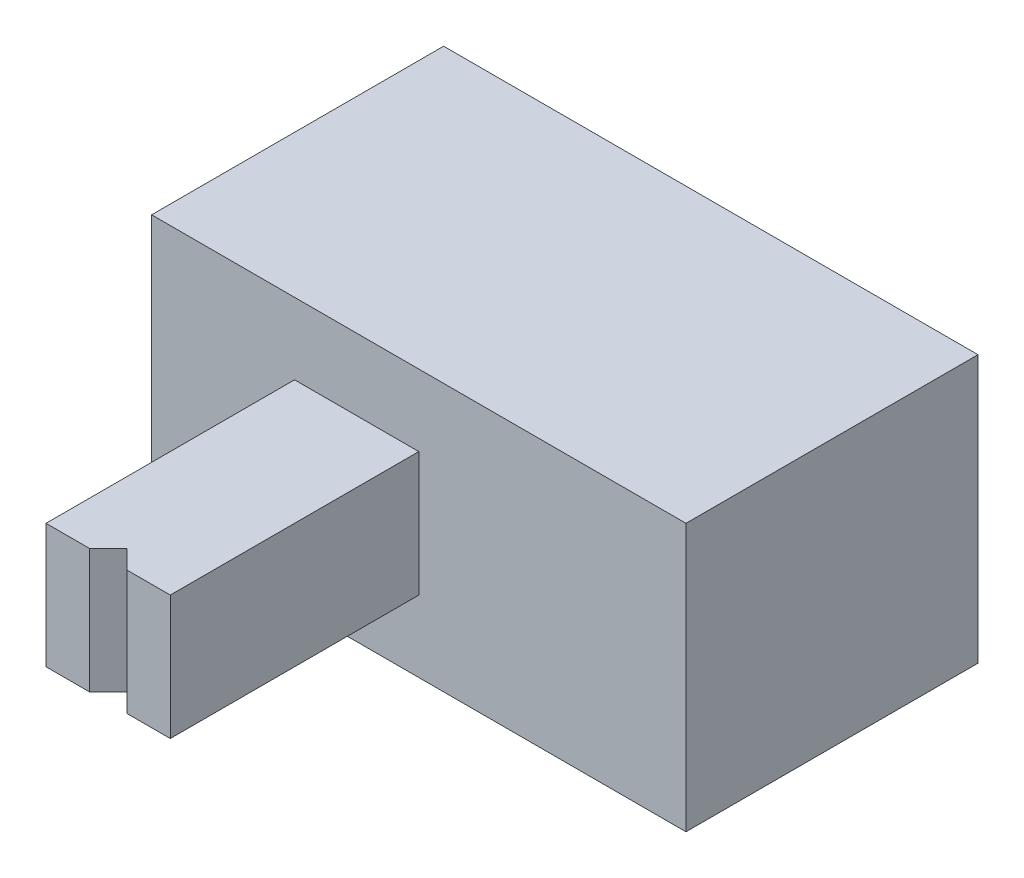
ISO-10303-21;
HEADER;
FILE_DESCRIPTION(('STEP AP214'),'2;1');
FILE_NAME('part.step','',(''),(''),'','','');
FILE_SCHEMA(('AUTOMOTIVE_DESIGN { 1 0 10303 214 1 1 1 1 }'));
ENDSEC;
DATA;
#1=APPLICATION_CONTEXT('core data for automotive mechanical design processes');
#2=APPLICATION_PROTOCOL_DEFINITION('international standard','automotive_design',2000,#1);
#3=PRODUCT_CONTEXT('',#1,'mechanical');
#4=PRODUCT('Part','Part','',(#3));
#5=PRODUCT_RELATED_PRODUCT_CATEGORY('part','',(#4));
#6=PRODUCT_DEFINITION_FORMATION('','',#4);
#7=PRODUCT_DEFINITION_CONTEXT('part definition',#1,'design');
#8=PRODUCT_DEFINITION('design','',#6,#7);
#9=PRODUCT_DEFINITION_SHAPE('','',#8);
#10=(LENGTH_UNIT() NAMED_UNIT(*) SI_UNIT(.MILLI.,.METRE.));
#11=(NAMED_UNIT(*) PLANE_ANGLE_UNIT() SI_UNIT($,.RADIAN.));
#12=(NAMED_UNIT(*) SI_UNIT($,.STERADIAN.) SOLID_ANGLE_UNIT());
#13=UNCERTAINTY_MEASURE_WITH_UNIT(LENGTH_MEASURE(1.E-05),#10,'distance_accuracy_value','');
#14=(GEOMETRIC_REPRESENTATION_CONTEXT(3) GLOBAL_UNCERTAINTY_ASSIGNED_CONTEXT((#13)) GLOBAL_UNIT_ASSIGNED_CONTEXT((#10,
#11,#12)) REPRESENTATION_CONTEXT('',''));
#15=CARTESIAN_POINT('',(0.,0.,0.));
#16=DIRECTION('',(0.,0.,1.));
#17=DIRECTION('',(1.,0.,0.));
#18=AXIS2_PLACEMENT_3D('',#15,#16,#17);
#19=CARTESIAN_POINT('',(-1.3,2.15,8.7));
#20=DIRECTION('',(-0.707106781186551,0.,-0.707106781186544));
#21=DIRECTION('',(-0.707106781186544,0.,0.707106781186551));
#22=AXIS2_PLACEMENT_3D('',#19,#20,#21);
#23=PLANE('',#22);
#24=DIRECTION('',(0.,1.,0.));
#25=VECTOR('',#24,1.);
#26=CARTESIAN_POINT('',(-1.3,0.,8.7));
#27=LINE('',#26,#25);
#28=CARTESIAN_POINT('',(-1.3,-1.,8.7));
#29=VERTEX_POINT('',#28);
#30=CARTESIAN_POINT('',(-1.3,1.,8.7));
#31=VERTEX_POINT('',#30);
#32=EDGE_CURVE('E28',#29,#31,#27,.T.);
#33=ORIENTED_EDGE('',*,*,#32,.F.);
#34=DIRECTION('',(0.707106781186545,0.,-0.70710678118655));
#35=VECTOR('',#34,1.);
#36=CARTESIAN_POINT('',(-1.3,-1.,8.7));
#37=LINE('',#36,#35);
#38=CARTESIAN_POINT('',(-1.,-1.,8.4));
#39=VERTEX_POINT('',#38);
#40=EDGE_CURVE('E182',#29,#39,#37,.T.);
#41=ORIENTED_EDGE('',*,*,#40,.T.);
#42=DIRECTION('',(0.,-1.,0.));
#43=VECTOR('',#42,1.);
#44=CARTESIAN_POINT('',(-1.,2.15,8.4));
#45=LINE('',#44,#43);
#46=CARTESIAN_POINT('',(-1.,1.,8.4));
#47=VERTEX_POINT('',#46);
#48=EDGE_CURVE('E11',#47,#39,#45,.T.);
#49=ORIENTED_EDGE('',*,*,#48,.F.);
#50=DIRECTION('',(0.707106781186544,0.,-0.707106781186551));
#51=VECTOR('',#50,1.);
#52=CARTESIAN_POINT('',(-1.65,1.,9.05));
#53=LINE('',#52,#51);
#54=EDGE_CURVE('E201',#31,#47,#53,.T.);
#55=ORIENTED_EDGE('',*,*,#54,.F.);
#56=EDGE_LOOP('',(#33,#41,#49,#55));
#57=FACE_BOUND('',#56,.T.);
#58=ADVANCED_FACE('F17',(#57),#23,.F.);
#59=CARTESIAN_POINT('',(-1.,2.15,8.4));
#60=DIRECTION('',(0.707106781186549,0.,-0.707106781186546));
#61=DIRECTION('',(0.,-1.,0.));
#62=AXIS2_PLACEMENT_3D('',#59,#60,#61);
#63=PLANE('',#62);
#64=ORIENTED_EDGE('',*,*,#48,.T.);
#65=DIRECTION('',(0.707106781186546,0.,0.707106781186549));
#66=VECTOR('',#65,1.);
#67=CARTESIAN_POINT('',(-1.,-1.,8.4));
#68=LINE('',#67,#66);
#69=CARTESIAN_POINT('',(-0.7,-1.,8.7));
#70=VERTEX_POINT('',#69);
#71=EDGE_CURVE('E170',#39,#70,#68,.T.);
#72=ORIENTED_EDGE('',*,*,#71,.T.);
#73=DIRECTION('',(0.,-1.,0.));
#74=VECTOR('',#73,1.);
#75=CARTESIAN_POINT('',(-0.7,0.,8.7));
#76=LINE('',#75,#74);
#77=CARTESIAN_POINT('',(-0.7,1.,8.7));
#78=VERTEX_POINT('',#77);
#79=EDGE_CURVE('E205',#78,#70,#76,.T.);
#80=ORIENTED_EDGE('',*,*,#79,.F.);
#81=DIRECTION('',(0.707106781186546,0.,0.707106781186549));
#82=VECTOR('',#81,1.);
#83=CARTESIAN_POINT('',(-1.35,1.,8.05));
#84=LINE('',#83,#82);
#85=EDGE_CURVE('E197',#47,#78,#84,.T.);
#86=ORIENTED_EDGE('',*,*,#85,.F.);
#87=EDGE_LOOP('',(#64,#72,#80,#86));
#88=FACE_BOUND('',#87,.T.);
#89=ADVANCED_FACE('F266',(#88),#63,.F.);
#90=CARTESIAN_POINT('',(0.,0.,8.7));
#91=DIRECTION('',(0.,0.,-1.));
#92=DIRECTION('',(0.,-1.,0.));
#93=AXIS2_PLACEMENT_3D('',#90,#91,#92);
#94=PLANE('',#93);
#95=DIRECTION('',(1.,0.,0.));
#96=VECTOR('',#95,1.);
#97=CARTESIAN_POINT('',(-2.,-1.,8.7));
#98=LINE('',#97,#96);
#99=CARTESIAN_POINT('',(-2.,-1.,8.7));
#100=VERTEX_POINT('',#99);
#101=EDGE_CURVE('E185',#100,#29,#98,.T.);
#102=ORIENTED_EDGE('',*,*,#101,.T.);
#103=ORIENTED_EDGE('',*,*,#32,.T.);
#104=DIRECTION('',(-1.,0.,0.));
#105=VECTOR('',#104,1.);
#106=CARTESIAN_POINT('',(-2.,1.,8.7));
#107=LINE('',#106,#105);
#108=CARTESIAN_POINT('',(-2.,1.,8.7));
#109=VERTEX_POINT('',#108);
#110=EDGE_CURVE('E215',#31,#109,#107,.T.);
#111=ORIENTED_EDGE('',*,*,#110,.T.);
#112=DIRECTION('',(0.,-1.,0.));
#113=VECTOR('',#112,1.);
#114=CARTESIAN_POINT('',(-2.,-1.,8.7));
#115=LINE('',#114,#113);
#116=EDGE_CURVE('E21',#109,#100,#115,.T.);
#117=ORIENTED_EDGE('',*,*,#116,.T.);
#118=EDGE_LOOP('',(#102,#103,#111,#117));
#119=FACE_BOUND('',#118,.T.);
#120=ADVANCED_FACE('F19',(#119),#94,.F.);
#121=CARTESIAN_POINT('',(-2.,-1.,8.7));
#122=DIRECTION('',(0.,1.,0.));
#123=DIRECTION('',(1.,0.,0.));
#124=AXIS2_PLACEMENT_3D('',#121,#122,#123);
#125=PLANE('',#124);
#126=DIRECTION('',(1.,0.,0.));
#127=VECTOR('',#126,1.);
#128=CARTESIAN_POINT('',(-2.,-1.,8.7));
#129=LINE('',#128,#127);
#130=CARTESIAN_POINT('',(0.,-1.,8.7));
#131=VERTEX_POINT('',#130);
#132=EDGE_CURVE('E190',#70,#131,#129,.T.);
#133=ORIENTED_EDGE('',*,*,#132,.F.);
#134=ORIENTED_EDGE('',*,*,#71,.F.);
#135=ORIENTED_EDGE('',*,*,#40,.F.);
#136=ORIENTED_EDGE('',*,*,#101,.F.);
#137=DIRECTION('',(0.,0.,-1.));
#138=VECTOR('',#137,1.);
#139=CARTESIAN_POINT('',(-2.,-1.,8.7));
#140=LINE('',#139,#138);
#141=CARTESIAN_POINT('',(-2.,-1.,4.7));
#142=VERTEX_POINT('',#141);
#143=EDGE_CURVE('E87',#100,#142,#140,.T.);
#144=ORIENTED_EDGE('',*,*,#143,.T.);
#145=DIRECTION('',(1.,0.,0.));
#146=VECTOR('',#145,1.);
#147=CARTESIAN_POINT('',(-2.,-1.,4.7));
#148=LINE('',#147,#146);
#149=CARTESIAN_POINT('',(0.,-1.,4.7));
#150=VERTEX_POINT('',#149);
#151=EDGE_CURVE('E172',#142,#150,#148,.T.);
#152=ORIENTED_EDGE('',*,*,#151,.T.);
#153=DIRECTION('',(0.,0.,-1.));
#154=VECTOR('',#153,1.);
#155=CARTESIAN_POINT('',(0.,-1.,8.7));
#156=LINE('',#155,#154);
#157=EDGE_CURVE('E98',#131,#150,#156,.T.);
#158=ORIENTED_EDGE('',*,*,#157,.F.);
#159=EDGE_LOOP('',(#133,#134,#135,#136,#144,#152,#158));
#160=FACE_BOUND('',#159,.T.);
#161=ADVANCED_FACE('F269',(#160),#125,.F.);
#162=CARTESIAN_POINT('',(-2.,-1.,8.7));
#163=DIRECTION('',(1.,0.,0.));
#164=DIRECTION('',(0.,0.,-1.));
#165=AXIS2_PLACEMENT_3D('',#162,#163,#164);
#166=PLANE('',#165);
#167=DIRECTION('',(0.,-1.,0.));
#168=VECTOR('',#167,1.);
#169=CARTESIAN_POINT('',(-2.,-1.,4.7));
#170=LINE('',#169,#168);
#171=CARTESIAN_POINT('',(-2.,1.,4.7));
#172=VERTEX_POINT('',#171);
#173=EDGE_CURVE('E174',#172,#142,#170,.T.);
#174=ORIENTED_EDGE('',*,*,#173,.T.);
#175=ORIENTED_EDGE('',*,*,#143,.F.);
#176=ORIENTED_EDGE('',*,*,#116,.F.);
#177=DIRECTION('',(0.,0.,-1.));
#178=VECTOR('',#177,1.);
#179=CARTESIAN_POINT('',(-2.,1.,8.7));
#180=LINE('',#179,#178);
#181=EDGE_CURVE('E200',#109,#172,#180,.T.);
#182=ORIENTED_EDGE('',*,*,#181,.T.);
#183=EDGE_LOOP('',(#174,#175,#176,#182));
#184=FACE_BOUND('',#183,.T.);
#185=ADVANCED_FACE('F280',(#184),#166,.F.);
#186=CARTESIAN_POINT('',(-2.,1.,8.7));
#187=DIRECTION('',(0.,-1.,0.));
#188=DIRECTION('',(-1.,0.,0.));
#189=AXIS2_PLACEMENT_3D('',#186,#187,#188);
#190=PLANE('',#189);
#191=ORIENTED_EDGE('',*,*,#54,.T.);
#192=ORIENTED_EDGE('',*,*,#85,.T.);
#193=DIRECTION('',(-1.,0.,0.));
#194=VECTOR('',#193,1.);
#195=CARTESIAN_POINT('',(-2.,1.,8.7));
#196=LINE('',#195,#194);
#197=CARTESIAN_POINT('',(0.,1.,8.7));
#198=VERTEX_POINT('',#197);
#199=EDGE_CURVE('E222',#198,#78,#196,.T.);
#200=ORIENTED_EDGE('',*,*,#199,.F.);
#201=DIRECTION('',(0.,0.,-1.));
#202=VECTOR('',#201,1.);
#203=CARTESIAN_POINT('',(0.,1.,8.7));
#204=LINE('',#203,#202);
#205=CARTESIAN_POINT('',(0.,1.,4.7));
#206=VERTEX_POINT('',#205);
#207=EDGE_CURVE('E206',#198,#206,#204,.T.);
#208=ORIENTED_EDGE('',*,*,#207,.T.);
#209=DIRECTION('',(-1.,0.,0.));
#210=VECTOR('',#209,1.);
#211=CARTESIAN_POINT('',(-2.,1.,4.7));
#212=LINE('',#211,#210);
#213=EDGE_CURVE('E178',#206,#172,#212,.T.);
#214=ORIENTED_EDGE('',*,*,#213,.T.);
#215=ORIENTED_EDGE('',*,*,#181,.F.);
#216=ORIENTED_EDGE('',*,*,#110,.F.);
#217=EDGE_LOOP('',(#191,#192,#200,#208,#214,#215,#216));
#218=FACE_BOUND('',#217,.T.);
#219=ADVANCED_FACE('F274',(#218),#190,.F.);
#220=CARTESIAN_POINT('',(0.,-1.,8.7));
#221=DIRECTION('',(-1.,0.,0.));
#222=DIRECTION('',(0.,0.,1.));
#223=AXIS2_PLACEMENT_3D('',#220,#221,#222);
#224=PLANE('',#223);
#225=DIRECTION('',(0.,1.,0.));
#226=VECTOR('',#225,1.);
#227=CARTESIAN_POINT('',(0.,-1.,4.7));
#228=LINE('',#227,#226);
#229=EDGE_CURVE('E175',#150,#206,#228,.T.);
#230=ORIENTED_EDGE('',*,*,#229,.T.);
#231=ORIENTED_EDGE('',*,*,#207,.F.);
#232=DIRECTION('',(0.,1.,0.));
#233=VECTOR('',#232,1.);
#234=CARTESIAN_POINT('',(0.,-1.,8.7));
#235=LINE('',#234,#233);
#236=EDGE_CURVE('E166',#131,#198,#235,.T.);
#237=ORIENTED_EDGE('',*,*,#236,.F.);
#238=ORIENTED_EDGE('',*,*,#157,.T.);
#239=EDGE_LOOP('',(#230,#231,#237,#238));
#240=FACE_BOUND('',#239,.T.);
#241=ADVANCED_FACE('F284',(#240),#224,.F.);
#242=CARTESIAN_POINT('',(0.,0.,0.));
#243=DIRECTION('',(0.,0.,1.));
#244=DIRECTION('',(0.,-1.,0.));
#245=AXIS2_PLACEMENT_3D('',#242,#243,#244);
#246=PLANE('',#245);
#247=DIRECTION('',(0.,1.,0.));
#248=VECTOR('',#247,1.);
#249=CARTESIAN_POINT('',(4.3,2.15,0.));
#250=LINE('',#249,#248);
#251=CARTESIAN_POINT('',(4.3,-2.15,0.));
#252=VERTEX_POINT('',#251);
#253=CARTESIAN_POINT('',(4.3,2.15,0.));
#254=VERTEX_POINT('',#253);
#255=EDGE_CURVE('E196',#252,#254,#250,.T.);
#256=ORIENTED_EDGE('',*,*,#255,.F.);
#257=DIRECTION('',(1.,0.,0.));
#258=VECTOR('',#257,1.);
#259=CARTESIAN_POINT('',(-4.3,-2.15,0.));
#260=LINE('',#259,#258);
#261=CARTESIAN_POINT('',(-4.3,-2.15,0.));
#262=VERTEX_POINT('',#261);
#263=EDGE_CURVE('E181',#262,#252,#260,.T.);
#264=ORIENTED_EDGE('',*,*,#263,.F.);
#265=DIRECTION('',(0.,-1.,0.));
#266=VECTOR('',#265,1.);
#267=CARTESIAN_POINT('',(-4.3,2.15,0.));
#268=LINE('',#267,#266);
#269=CARTESIAN_POINT('',(-4.3,2.15,0.));
#270=VERTEX_POINT('',#269);
#271=EDGE_CURVE('E145',#270,#262,#268,.T.);
#272=ORIENTED_EDGE('',*,*,#271,.F.);
#273=DIRECTION('',(-1.,0.,0.));
#274=VECTOR('',#273,1.);
#275=CARTESIAN_POINT('',(-4.3,2.15,0.));
#276=LINE('',#275,#274);
#277=EDGE_CURVE('E141',#254,#270,#276,.T.);
#278=ORIENTED_EDGE('',*,*,#277,.F.);
#279=EDGE_LOOP('',(#256,#264,#272,#278));
#280=FACE_BOUND('',#279,.T.);
#281=ADVANCED_FACE('F244',(#280),#246,.F.);
#282=CARTESIAN_POINT('',(-4.3,-2.15,4.7));
#283=DIRECTION('',(0.,1.,0.));
#284=DIRECTION('',(0.,0.,-1.));
#285=AXIS2_PLACEMENT_3D('',#282,#283,#284);
#286=PLANE('',#285);
#287=ORIENTED_EDGE('',*,*,#263,.T.);
#288=DIRECTION('',(0.,0.,-1.));
#289=VECTOR('',#288,1.);
#290=CARTESIAN_POINT('',(4.3,-2.15,4.7));
#291=LINE('',#290,#289);
#292=CARTESIAN_POINT('',(4.3,-2.15,4.7));
#293=VERTEX_POINT('',#292);
#294=EDGE_CURVE('E195',#293,#252,#291,.T.);
#295=ORIENTED_EDGE('',*,*,#294,.F.);
#296=DIRECTION('',(1.,0.,0.));
#297=VECTOR('',#296,1.);
#298=CARTESIAN_POINT('',(-4.3,-2.15,4.7));
#299=LINE('',#298,#297);
#300=CARTESIAN_POINT('',(-4.3,-2.15,4.7));
#301=VERTEX_POINT('',#300);
#302=EDGE_CURVE('E155',#301,#293,#299,.T.);
#303=ORIENTED_EDGE('',*,*,#302,.F.);
#304=DIRECTION('',(0.,0.,-1.));
#305=VECTOR('',#304,1.);
#306=CARTESIAN_POINT('',(-4.3,-2.15,4.7));
#307=LINE('',#306,#305);
#308=EDGE_CURVE('E150',#301,#262,#307,.T.);
#309=ORIENTED_EDGE('',*,*,#308,.T.);
#310=EDGE_LOOP('',(#287,#295,#303,#309));
#311=FACE_BOUND('',#310,.T.);
#312=ADVANCED_FACE('F247',(#311),#286,.F.);
#313=CARTESIAN_POINT('',(-4.3,2.15,4.7));
#314=DIRECTION('',(1.,0.,0.));
#315=DIRECTION('',(0.,-1.,0.));
#316=AXIS2_PLACEMENT_3D('',#313,#314,#315);
#317=PLANE('',#316);
#318=ORIENTED_EDGE('',*,*,#271,.T.);
#319=ORIENTED_EDGE('',*,*,#308,.F.);
#320=DIRECTION('',(0.,-1.,0.));
#321=VECTOR('',#320,1.);
#322=CARTESIAN_POINT('',(-4.3,2.15,4.7));
#323=LINE('',#322,#321);
#324=CARTESIAN_POINT('',(-4.3,2.15,4.7));
#325=VERTEX_POINT('',#324);
#326=EDGE_CURVE('E147',#325,#301,#323,.T.);
#327=ORIENTED_EDGE('',*,*,#326,.F.);
#328=DIRECTION('',(0.,0.,-1.));
#329=VECTOR('',#328,1.);
#330=CARTESIAN_POINT('',(-4.3,2.15,4.7));
#331=LINE('',#330,#329);
#332=EDGE_CURVE('E134',#325,#270,#331,.T.);
#333=ORIENTED_EDGE('',*,*,#332,.T.);
#334=EDGE_LOOP('',(#318,#319,#327,#333));
#335=FACE_BOUND('',#334,.T.);
#336=ADVANCED_FACE('F148',(#335),#317,.F.);
#337=CARTESIAN_POINT('',(-4.3,2.15,4.7));
#338=DIRECTION('',(0.,-1.,0.));
#339=DIRECTION('',(-1.,0.,0.));
#340=AXIS2_PLACEMENT_3D('',#337,#338,#339);
#341=PLANE('',#340);
#342=ORIENTED_EDGE('',*,*,#277,.T.);
#343=ORIENTED_EDGE('',*,*,#332,.F.);
#344=DIRECTION('',(-1.,0.,0.));
#345=VECTOR('',#344,1.);
#346=CARTESIAN_POINT('',(-4.3,2.15,4.7));
#347=LINE('',#346,#345);
#348=CARTESIAN_POINT('',(4.3,2.15,4.7));
#349=VERTEX_POINT('',#348);
#350=EDGE_CURVE('E139',#349,#325,#347,.T.);
#351=ORIENTED_EDGE('',*,*,#350,.F.);
#352=DIRECTION('',(0.,0.,-1.));
#353=VECTOR('',#352,1.);
#354=CARTESIAN_POINT('',(4.3,2.15,4.7));
#355=LINE('',#354,#353);
#356=EDGE_CURVE('E192',#349,#254,#355,.T.);
#357=ORIENTED_EDGE('',*,*,#356,.T.);
#358=EDGE_LOOP('',(#342,#343,#351,#357));
#359=FACE_BOUND('',#358,.T.);
#360=ADVANCED_FACE('F136',(#359),#341,.F.);
#361=CARTESIAN_POINT('',(4.3,2.15,4.7));
#362=DIRECTION('',(-1.,0.,0.));
#363=DIRECTION('',(0.,0.,1.));
#364=AXIS2_PLACEMENT_3D('',#361,#362,#363);
#365=PLANE('',#364);
#366=ORIENTED_EDGE('',*,*,#255,.T.);
#367=ORIENTED_EDGE('',*,*,#356,.F.);
#368=DIRECTION('',(0.,1.,0.));
#369=VECTOR('',#368,1.);
#370=CARTESIAN_POINT('',(4.3,2.15,4.7));
#371=LINE('',#370,#369);
#372=EDGE_CURVE('E159',#293,#349,#371,.T.);
#373=ORIENTED_EDGE('',*,*,#372,.F.);
#374=ORIENTED_EDGE('',*,*,#294,.T.);
#375=EDGE_LOOP('',(#366,#367,#373,#374));
#376=FACE_BOUND('',#375,.T.);
#377=ADVANCED_FACE('F312',(#376),#365,.F.);
#378=CARTESIAN_POINT('',(0.,0.,4.7));
#379=DIRECTION('',(0.,0.,1.));
#380=DIRECTION('',(0.,-1.,0.));
#381=AXIS2_PLACEMENT_3D('',#378,#379,#380);
#382=PLANE('',#381);
#383=ORIENTED_EDGE('',*,*,#213,.F.);
#384=ORIENTED_EDGE('',*,*,#229,.F.);
#385=ORIENTED_EDGE('',*,*,#151,.F.);
#386=ORIENTED_EDGE('',*,*,#173,.F.);
#387=EDGE_LOOP('',(#383,#384,#385,#386));
#388=FACE_BOUND('',#387,.T.);
#389=ORIENTED_EDGE('',*,*,#372,.T.);
#390=ORIENTED_EDGE('',*,*,#350,.T.);
#391=ORIENTED_EDGE('',*,*,#326,.T.);
#392=ORIENTED_EDGE('',*,*,#302,.T.);
#393=EDGE_LOOP('',(#389,#390,#391,#392));
#394=FACE_BOUND('',#393,.T.);
#395=ADVANCED_FACE('F157',(#388,#394),#382,.T.);
#396=CARTESIAN_POINT('',(0.,0.,8.7));
#397=DIRECTION('',(0.,0.,-1.));
#398=DIRECTION('',(0.,-1.,0.));
#399=AXIS2_PLACEMENT_3D('',#396,#397,#398);
#400=PLANE('',#399);
#401=ORIENTED_EDGE('',*,*,#199,.T.);
#402=ORIENTED_EDGE('',*,*,#79,.T.);
#403=ORIENTED_EDGE('',*,*,#132,.T.);
#404=ORIENTED_EDGE('',*,*,#236,.T.);
#405=EDGE_LOOP('',(#401,#402,#403,#404));
#406=FACE_BOUND('',#405,.T.);
#407=ADVANCED_FACE('F271',(#406),#400,.F.);
#408=CLOSED_SHELL('',(#58,#89,#120,#161,#185,#219,#241,#281,#312,#336,#360,#377,#395,#407));
#409=MANIFOLD_SOLID_BREP('B1',#408);
#410=ADVANCED_BREP_SHAPE_REPRESENTATION('',(#18,#409),#14);
#411=SHAPE_DEFINITION_REPRESENTATION(#9,#410);
ENDSEC;
END-ISO-10303-21;
